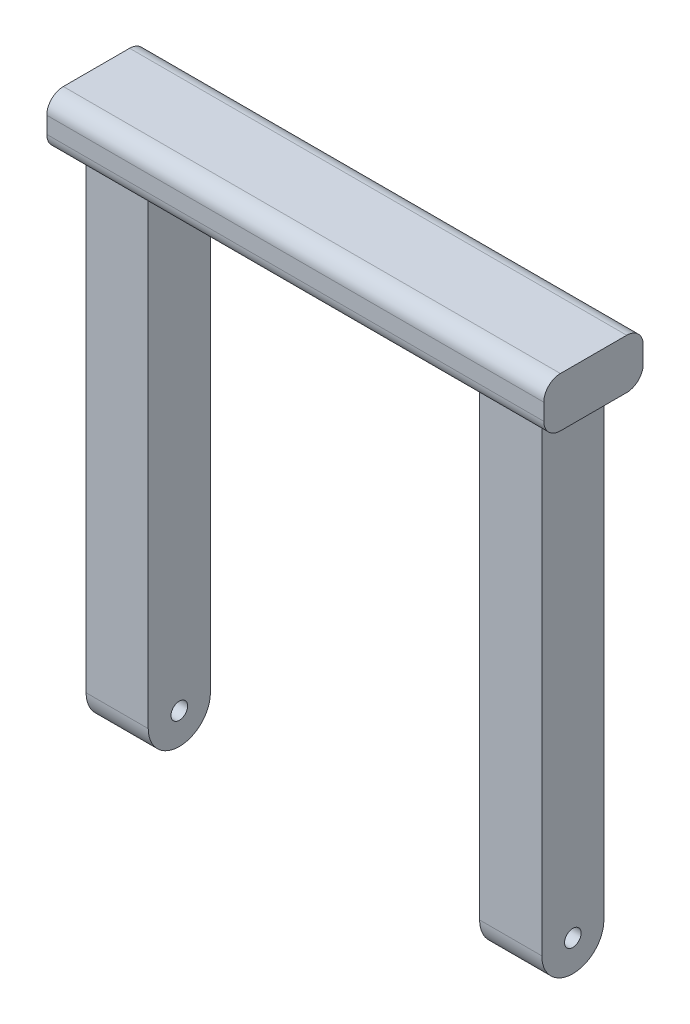
ISO-10303-21;
HEADER;
FILE_DESCRIPTION(('STEP AP214'),'2;1');
FILE_NAME('part.step','',(''),(''),'','','');
FILE_SCHEMA(('AUTOMOTIVE_DESIGN { 1 0 10303 214 1 1 1 1 }'));
ENDSEC;
DATA;
#1=APPLICATION_CONTEXT('core data for automotive mechanical design processes');
#2=APPLICATION_PROTOCOL_DEFINITION('international standard','automotive_design',2000,#1);
#3=PRODUCT_CONTEXT('',#1,'mechanical');
#4=PRODUCT('Part','Part','',(#3));
#5=PRODUCT_RELATED_PRODUCT_CATEGORY('part','',(#4));
#6=PRODUCT_DEFINITION_FORMATION('','',#4);
#7=PRODUCT_DEFINITION_CONTEXT('part definition',#1,'design');
#8=PRODUCT_DEFINITION('design','',#6,#7);
#9=PRODUCT_DEFINITION_SHAPE('','',#8);
#10=(LENGTH_UNIT() NAMED_UNIT(*) SI_UNIT(.MILLI.,.METRE.));
#11=(NAMED_UNIT(*) PLANE_ANGLE_UNIT() SI_UNIT($,.RADIAN.));
#12=(NAMED_UNIT(*) SI_UNIT($,.STERADIAN.) SOLID_ANGLE_UNIT());
#13=UNCERTAINTY_MEASURE_WITH_UNIT(LENGTH_MEASURE(1.E-05),#10,'distance_accuracy_value','');
#14=(GEOMETRIC_REPRESENTATION_CONTEXT(3) GLOBAL_UNCERTAINTY_ASSIGNED_CONTEXT((#13)) GLOBAL_UNIT_ASSIGNED_CONTEXT((#10,
#11,#12)) REPRESENTATION_CONTEXT('',''));
#15=CARTESIAN_POINT('',(0.,0.,0.));
#16=DIRECTION('',(0.,0.,1.));
#17=DIRECTION('',(1.,0.,0.));
#18=AXIS2_PLACEMENT_3D('',#15,#16,#17);
#19=CARTESIAN_POINT('',(0.,0.,0.));
#20=DIRECTION('',(0.,-1.,0.));
#21=DIRECTION('',(0.,0.,-1.));
#22=AXIS2_PLACEMENT_3D('',#19,#20,#21);
#23=PLANE('',#22);
#24=DIRECTION('',(0.,0.,1.));
#25=VECTOR('',#24,1.);
#26=CARTESIAN_POINT('',(0.,0.,0.));
#27=LINE('',#26,#25);
#28=CARTESIAN_POINT('',(0.,0.,-25.4));
#29=VERTEX_POINT('',#28);
#30=CARTESIAN_POINT('',(0.,0.,-5.08));
#31=VERTEX_POINT('',#30);
#32=EDGE_CURVE('E212',#29,#31,#27,.T.);
#33=ORIENTED_EDGE('',*,*,#32,.F.);
#34=DIRECTION('',(-1.,0.,0.));
#35=VECTOR('',#34,1.);
#36=CARTESIAN_POINT('',(152.4,0.,-25.4));
#37=LINE('',#36,#35);
#38=CARTESIAN_POINT('',(152.4,0.,-25.4));
#39=VERTEX_POINT('',#38);
#40=EDGE_CURVE('E293',#29,#39,#37,.F.);
#41=ORIENTED_EDGE('',*,*,#40,.T.);
#42=DIRECTION('',(0.,0.,-1.));
#43=VECTOR('',#42,1.);
#44=CARTESIAN_POINT('',(152.4,0.,0.));
#45=LINE('',#44,#43);
#46=CARTESIAN_POINT('',(152.4,0.,-5.08));
#47=VERTEX_POINT('',#46);
#48=EDGE_CURVE('E216',#47,#39,#45,.T.);
#49=ORIENTED_EDGE('',*,*,#48,.F.);
#50=DIRECTION('',(1.,0.,0.));
#51=VECTOR('',#50,1.);
#52=CARTESIAN_POINT('',(0.,0.,-5.08));
#53=LINE('',#52,#51);
#54=EDGE_CURVE('E283',#47,#31,#53,.F.);
#55=ORIENTED_EDGE('',*,*,#54,.T.);
#56=EDGE_LOOP('',(#33,#41,#49,#55));
#57=FACE_BOUND('',#56,.T.);
#58=DIRECTION('',(1.,0.,0.));
#59=VECTOR('',#58,1.);
#60=CARTESIAN_POINT('',(6.35000000000003,0.,-24.765));
#61=LINE('',#60,#59);
#62=CARTESIAN_POINT('',(6.35000000000003,0.,-24.765));
#63=VERTEX_POINT('',#62);
#64=CARTESIAN_POINT('',(25.4,0.,-24.765));
#65=VERTEX_POINT('',#64);
#66=EDGE_CURVE('E195',#63,#65,#61,.T.);
#67=ORIENTED_EDGE('',*,*,#66,.F.);
#68=DIRECTION('',(0.,0.,-1.));
#69=VECTOR('',#68,1.);
#70=CARTESIAN_POINT('',(6.35000000000003,0.,-5.71500000000002));
#71=LINE('',#70,#69);
#72=CARTESIAN_POINT('',(6.35000000000003,0.,-5.71500000000002));
#73=VERTEX_POINT('',#72);
#74=EDGE_CURVE('E168',#73,#63,#71,.T.);
#75=ORIENTED_EDGE('',*,*,#74,.F.);
#76=DIRECTION('',(-1.,0.,0.));
#77=VECTOR('',#76,1.);
#78=CARTESIAN_POINT('',(6.35000000000003,0.,-5.71500000000002));
#79=LINE('',#78,#77);
#80=CARTESIAN_POINT('',(25.4,0.,-5.71500000000002));
#81=VERTEX_POINT('',#80);
#82=EDGE_CURVE('E201',#81,#73,#79,.T.);
#83=ORIENTED_EDGE('',*,*,#82,.F.);
#84=DIRECTION('',(0.,0.,1.));
#85=VECTOR('',#84,1.);
#86=CARTESIAN_POINT('',(25.4,0.,-5.71500000000002));
#87=LINE('',#86,#85);
#88=EDGE_CURVE('E198',#65,#81,#87,.T.);
#89=ORIENTED_EDGE('',*,*,#88,.F.);
#90=EDGE_LOOP('',(#67,#75,#83,#89));
#91=FACE_BOUND('',#90,.T.);
#92=DIRECTION('',(-1.,0.,0.));
#93=VECTOR('',#92,1.);
#94=CARTESIAN_POINT('',(146.05,0.,-5.71500000000001));
#95=LINE('',#94,#93);
#96=CARTESIAN_POINT('',(146.05,0.,-5.71500000000001));
#97=VERTEX_POINT('',#96);
#98=CARTESIAN_POINT('',(127.,0.,-5.71500000000001));
#99=VERTEX_POINT('',#98);
#100=EDGE_CURVE('E162',#97,#99,#95,.T.);
#101=ORIENTED_EDGE('',*,*,#100,.F.);
#102=DIRECTION('',(0.,0.,1.));
#103=VECTOR('',#102,1.);
#104=CARTESIAN_POINT('',(146.05,0.,-5.71500000000001));
#105=LINE('',#104,#103);
#106=CARTESIAN_POINT('',(146.05,0.,-24.765));
#107=VERTEX_POINT('',#106);
#108=EDGE_CURVE('E172',#107,#97,#105,.T.);
#109=ORIENTED_EDGE('',*,*,#108,.F.);
#110=DIRECTION('',(1.,0.,0.));
#111=VECTOR('',#110,1.);
#112=CARTESIAN_POINT('',(146.05,0.,-24.765));
#113=LINE('',#112,#111);
#114=CARTESIAN_POINT('',(127.,0.,-24.765));
#115=VERTEX_POINT('',#114);
#116=EDGE_CURVE('E184',#115,#107,#113,.T.);
#117=ORIENTED_EDGE('',*,*,#116,.F.);
#118=DIRECTION('',(0.,0.,-1.));
#119=VECTOR('',#118,1.);
#120=CARTESIAN_POINT('',(127.,0.,-5.71500000000001));
#121=LINE('',#120,#119);
#122=EDGE_CURVE('E182',#99,#115,#121,.T.);
#123=ORIENTED_EDGE('',*,*,#122,.F.);
#124=EDGE_LOOP('',(#101,#109,#117,#123));
#125=FACE_BOUND('',#124,.T.);
#126=ADVANCED_FACE('F34',(#57,#91,#125),#23,.T.);
#127=CARTESIAN_POINT('',(0.,15.24,0.));
#128=DIRECTION('',(1.,0.,0.));
#129=DIRECTION('',(0.,0.,-1.));
#130=AXIS2_PLACEMENT_3D('',#127,#128,#129);
#131=PLANE('',#130);
#132=DIRECTION('',(0.,0.,1.));
#133=VECTOR('',#132,1.);
#134=CARTESIAN_POINT('',(0.,15.24,0.));
#135=LINE('',#134,#133);
#136=CARTESIAN_POINT('',(0.,15.24,-25.4));
#137=VERTEX_POINT('',#136);
#138=CARTESIAN_POINT('',(0.,15.24,-5.08));
#139=VERTEX_POINT('',#138);
#140=EDGE_CURVE('E213',#137,#139,#135,.T.);
#141=ORIENTED_EDGE('',*,*,#140,.F.);
#142=CARTESIAN_POINT('',(0.,10.16,-25.4));
#143=DIRECTION('',(1.,0.,0.));
#144=DIRECTION('',(0.,0.,-1.));
#145=AXIS2_PLACEMENT_3D('',#142,#143,#144);
#146=CIRCLE('',#145,5.08);
#147=CARTESIAN_POINT('',(0.,10.16,-30.48));
#148=VERTEX_POINT('',#147);
#149=EDGE_CURVE('E56',#137,#148,#146,.F.);
#150=ORIENTED_EDGE('',*,*,#149,.T.);
#151=DIRECTION('',(0.,-1.,0.));
#152=VECTOR('',#151,1.);
#153=CARTESIAN_POINT('',(0.,15.24,-30.48));
#154=LINE('',#153,#152);
#155=CARTESIAN_POINT('',(0.,5.08,-30.48));
#156=VERTEX_POINT('',#155);
#157=EDGE_CURVE('E219',#148,#156,#154,.T.);
#158=ORIENTED_EDGE('',*,*,#157,.T.);
#159=CARTESIAN_POINT('',(0.,5.08,-25.4));
#160=DIRECTION('',(1.,0.,0.));
#161=DIRECTION('',(0.,0.,-1.));
#162=AXIS2_PLACEMENT_3D('',#159,#160,#161);
#163=CIRCLE('',#162,5.08);
#164=EDGE_CURVE('E291',#156,#29,#163,.F.);
#165=ORIENTED_EDGE('',*,*,#164,.T.);
#166=ORIENTED_EDGE('',*,*,#32,.T.);
#167=CARTESIAN_POINT('',(0.,5.08,-5.08));
#168=DIRECTION('',(1.,0.,0.));
#169=DIRECTION('',(0.,0.,-1.));
#170=AXIS2_PLACEMENT_3D('',#167,#168,#169);
#171=CIRCLE('',#170,5.08);
#172=CARTESIAN_POINT('',(0.,5.08,0.));
#173=VERTEX_POINT('',#172);
#174=EDGE_CURVE('E286',#31,#173,#171,.F.);
#175=ORIENTED_EDGE('',*,*,#174,.T.);
#176=DIRECTION('',(0.,-1.,0.));
#177=VECTOR('',#176,1.);
#178=CARTESIAN_POINT('',(0.,15.24,0.));
#179=LINE('',#178,#177);
#180=CARTESIAN_POINT('',(0.,10.16,0.));
#181=VERTEX_POINT('',#180);
#182=EDGE_CURVE('E229',#181,#173,#179,.T.);
#183=ORIENTED_EDGE('',*,*,#182,.F.);
#184=CARTESIAN_POINT('',(0.,10.16,-5.08));
#185=DIRECTION('',(1.,0.,0.));
#186=DIRECTION('',(0.,0.,-1.));
#187=AXIS2_PLACEMENT_3D('',#184,#185,#186);
#188=CIRCLE('',#187,5.08);
#189=EDGE_CURVE('E275',#181,#139,#188,.F.);
#190=ORIENTED_EDGE('',*,*,#189,.T.);
#191=EDGE_LOOP('',(#141,#150,#158,#165,#166,#175,#183,#190));
#192=FACE_BOUND('',#191,.T.);
#193=ADVANCED_FACE('F307',(#192),#131,.F.);
#194=CARTESIAN_POINT('',(0.,15.24,0.));
#195=DIRECTION('',(0.,0.,-1.));
#196=DIRECTION('',(-1.,0.,0.));
#197=AXIS2_PLACEMENT_3D('',#194,#195,#196);
#198=PLANE('',#197);
#199=ORIENTED_EDGE('',*,*,#182,.T.);
#200=DIRECTION('',(1.,0.,0.));
#201=VECTOR('',#200,1.);
#202=CARTESIAN_POINT('',(152.4,5.08,0.));
#203=LINE('',#202,#201);
#204=CARTESIAN_POINT('',(152.4,5.08,0.));
#205=VERTEX_POINT('',#204);
#206=EDGE_CURVE('E278',#173,#205,#203,.T.);
#207=ORIENTED_EDGE('',*,*,#206,.T.);
#208=DIRECTION('',(0.,-1.,0.));
#209=VECTOR('',#208,1.);
#210=CARTESIAN_POINT('',(152.4,15.24,0.));
#211=LINE('',#210,#209);
#212=CARTESIAN_POINT('',(152.4,10.16,0.));
#213=VERTEX_POINT('',#212);
#214=EDGE_CURVE('E226',#213,#205,#211,.T.);
#215=ORIENTED_EDGE('',*,*,#214,.F.);
#216=DIRECTION('',(1.,0.,0.));
#217=VECTOR('',#216,1.);
#218=CARTESIAN_POINT('',(0.,10.16,0.));
#219=LINE('',#218,#217);
#220=EDGE_CURVE('E273',#213,#181,#219,.F.);
#221=ORIENTED_EDGE('',*,*,#220,.T.);
#222=EDGE_LOOP('',(#199,#207,#215,#221));
#223=FACE_BOUND('',#222,.T.);
#224=ADVANCED_FACE('F330',(#223),#198,.F.);
#225=CARTESIAN_POINT('',(152.4,15.24,0.));
#226=DIRECTION('',(-1.,0.,0.));
#227=DIRECTION('',(0.,0.,1.));
#228=AXIS2_PLACEMENT_3D('',#225,#226,#227);
#229=PLANE('',#228);
#230=DIRECTION('',(0.,-1.,0.));
#231=VECTOR('',#230,1.);
#232=CARTESIAN_POINT('',(152.4,15.24,-30.48));
#233=LINE('',#232,#231);
#234=CARTESIAN_POINT('',(152.4,10.16,-30.48));
#235=VERTEX_POINT('',#234);
#236=CARTESIAN_POINT('',(152.4,5.08,-30.48));
#237=VERTEX_POINT('',#236);
#238=EDGE_CURVE('E224',#235,#237,#233,.T.);
#239=ORIENTED_EDGE('',*,*,#238,.F.);
#240=CARTESIAN_POINT('',(152.4,10.16,-25.4));
#241=DIRECTION('',(-1.,0.,0.));
#242=DIRECTION('',(0.,0.,1.));
#243=AXIS2_PLACEMENT_3D('',#240,#241,#242);
#244=CIRCLE('',#243,5.08);
#245=CARTESIAN_POINT('',(152.4,15.24,-25.4));
#246=VERTEX_POINT('',#245);
#247=EDGE_CURVE('E11',#235,#246,#244,.F.);
#248=ORIENTED_EDGE('',*,*,#247,.T.);
#249=DIRECTION('',(0.,0.,-1.));
#250=VECTOR('',#249,1.);
#251=CARTESIAN_POINT('',(152.4,15.24,0.));
#252=LINE('',#251,#250);
#253=CARTESIAN_POINT('',(152.4,15.24,-5.08));
#254=VERTEX_POINT('',#253);
#255=EDGE_CURVE('E215',#254,#246,#252,.T.);
#256=ORIENTED_EDGE('',*,*,#255,.F.);
#257=CARTESIAN_POINT('',(152.4,10.16,-5.08));
#258=DIRECTION('',(-1.,0.,0.));
#259=DIRECTION('',(0.,0.,1.));
#260=AXIS2_PLACEMENT_3D('',#257,#258,#259);
#261=CIRCLE('',#260,5.08);
#262=EDGE_CURVE('E271',#254,#213,#261,.F.);
#263=ORIENTED_EDGE('',*,*,#262,.T.);
#264=ORIENTED_EDGE('',*,*,#214,.T.);
#265=CARTESIAN_POINT('',(152.4,5.08,-5.08));
#266=DIRECTION('',(-1.,0.,0.));
#267=DIRECTION('',(0.,0.,1.));
#268=AXIS2_PLACEMENT_3D('',#265,#266,#267);
#269=CIRCLE('',#268,5.08);
#270=EDGE_CURVE('E281',#205,#47,#269,.F.);
#271=ORIENTED_EDGE('',*,*,#270,.T.);
#272=ORIENTED_EDGE('',*,*,#48,.T.);
#273=CARTESIAN_POINT('',(152.4,5.08,-25.4));
#274=DIRECTION('',(-1.,0.,0.));
#275=DIRECTION('',(0.,0.,1.));
#276=AXIS2_PLACEMENT_3D('',#273,#274,#275);
#277=CIRCLE('',#276,5.08);
#278=EDGE_CURVE('E295',#39,#237,#277,.F.);
#279=ORIENTED_EDGE('',*,*,#278,.T.);
#280=EDGE_LOOP('',(#239,#248,#256,#263,#264,#271,#272,#279));
#281=FACE_BOUND('',#280,.T.);
#282=ADVANCED_FACE('F315',(#281),#229,.F.);
#283=CARTESIAN_POINT('',(0.,15.24,-30.48));
#284=DIRECTION('',(0.,0.,1.));
#285=DIRECTION('',(1.,0.,0.));
#286=AXIS2_PLACEMENT_3D('',#283,#284,#285);
#287=PLANE('',#286);
#288=ORIENTED_EDGE('',*,*,#157,.F.);
#289=DIRECTION('',(-1.,0.,0.));
#290=VECTOR('',#289,1.);
#291=CARTESIAN_POINT('',(0.,10.16,-30.48));
#292=LINE('',#291,#290);
#293=EDGE_CURVE('E42',#148,#235,#292,.F.);
#294=ORIENTED_EDGE('',*,*,#293,.T.);
#295=ORIENTED_EDGE('',*,*,#238,.T.);
#296=DIRECTION('',(-1.,0.,0.));
#297=VECTOR('',#296,1.);
#298=CARTESIAN_POINT('',(0.,5.08,-30.48));
#299=LINE('',#298,#297);
#300=EDGE_CURVE('E288',#237,#156,#299,.T.);
#301=ORIENTED_EDGE('',*,*,#300,.T.);
#302=EDGE_LOOP('',(#288,#294,#295,#301));
#303=FACE_BOUND('',#302,.T.);
#304=ADVANCED_FACE('F337',(#303),#287,.F.);
#305=CARTESIAN_POINT('',(0.,15.24,0.));
#306=DIRECTION('',(0.,-1.,0.));
#307=DIRECTION('',(0.,0.,-1.));
#308=AXIS2_PLACEMENT_3D('',#305,#306,#307);
#309=PLANE('',#308);
#310=ORIENTED_EDGE('',*,*,#255,.T.);
#311=DIRECTION('',(-1.,0.,0.));
#312=VECTOR('',#311,1.);
#313=CARTESIAN_POINT('',(0.,15.24,-25.4));
#314=LINE('',#313,#312);
#315=EDGE_CURVE('E298',#246,#137,#314,.T.);
#316=ORIENTED_EDGE('',*,*,#315,.T.);
#317=ORIENTED_EDGE('',*,*,#140,.T.);
#318=DIRECTION('',(1.,0.,0.));
#319=VECTOR('',#318,1.);
#320=CARTESIAN_POINT('',(0.,15.24,-5.08));
#321=LINE('',#320,#319);
#322=EDGE_CURVE('E268',#139,#254,#321,.T.);
#323=ORIENTED_EDGE('',*,*,#322,.T.);
#324=EDGE_LOOP('',(#310,#316,#317,#323));
#325=FACE_BOUND('',#324,.T.);
#326=ADVANCED_FACE('F303',(#325),#309,.F.);
#327=CARTESIAN_POINT('',(6.35000000000003,-152.4,-5.71500000000002));
#328=DIRECTION('',(1.,0.,0.));
#329=DIRECTION('',(0.,0.,-1.));
#330=AXIS2_PLACEMENT_3D('',#327,#328,#329);
#331=PLANE('',#330);
#332=CARTESIAN_POINT('',(6.35000000000003,-142.875,-15.24));
#333=DIRECTION('',(-1.,0.,0.));
#334=DIRECTION('',(0.,0.,1.));
#335=AXIS2_PLACEMENT_3D('',#332,#333,#334);
#336=CIRCLE('',#335,2.54000000000001);
#337=CARTESIAN_POINT('',(6.35000000000003,-142.875,-12.7));
#338=VERTEX_POINT('',#337);
#339=EDGE_CURVE('E237',#338,#338,#336,.T.);
#340=ORIENTED_EDGE('',*,*,#339,.F.);
#341=EDGE_LOOP('',(#340));
#342=FACE_BOUND('',#341,.T.);
#343=DIRECTION('',(0.,1.,0.));
#344=VECTOR('',#343,1.);
#345=CARTESIAN_POINT('',(6.35000000000003,-152.4,-24.765));
#346=LINE('',#345,#344);
#347=CARTESIAN_POINT('',(6.35000000000003,-142.875,-24.765));
#348=VERTEX_POINT('',#347);
#349=EDGE_CURVE('E210',#348,#63,#346,.T.);
#350=ORIENTED_EDGE('',*,*,#349,.F.);
#351=CARTESIAN_POINT('',(6.35000000000003,-142.875,-15.24));
#352=DIRECTION('',(1.,0.,0.));
#353=DIRECTION('',(0.,0.,-1.));
#354=AXIS2_PLACEMENT_3D('',#351,#352,#353);
#355=CIRCLE('',#354,9.525);
#356=CARTESIAN_POINT('',(6.35000000000003,-152.4,-15.24));
#357=VERTEX_POINT('',#356);
#358=EDGE_CURVE('E251',#348,#357,#355,.F.);
#359=ORIENTED_EDGE('',*,*,#358,.T.);
#360=CARTESIAN_POINT('',(6.35000000000003,-142.875,-15.24));
#361=DIRECTION('',(1.,0.,0.));
#362=DIRECTION('',(0.,0.,-1.));
#363=AXIS2_PLACEMENT_3D('',#360,#361,#362);
#364=CIRCLE('',#363,9.525);
#365=CARTESIAN_POINT('',(6.35000000000003,-142.875,-5.71500000000002));
#366=VERTEX_POINT('',#365);
#367=EDGE_CURVE('E240',#357,#366,#364,.F.);
#368=ORIENTED_EDGE('',*,*,#367,.T.);
#369=DIRECTION('',(0.,1.,0.));
#370=VECTOR('',#369,1.);
#371=CARTESIAN_POINT('',(6.35000000000003,-152.4,-5.71500000000002));
#372=LINE('',#371,#370);
#373=EDGE_CURVE('E204',#366,#73,#372,.T.);
#374=ORIENTED_EDGE('',*,*,#373,.T.);
#375=ORIENTED_EDGE('',*,*,#74,.T.);
#376=EDGE_LOOP('',(#350,#359,#368,#374,#375));
#377=FACE_BOUND('',#376,.T.);
#378=ADVANCED_FACE('F413',(#342,#377),#331,.F.);
#379=CARTESIAN_POINT('',(6.35000000000003,-152.4,-24.765));
#380=DIRECTION('',(0.,0.,1.));
#381=DIRECTION('',(1.,0.,0.));
#382=AXIS2_PLACEMENT_3D('',#379,#380,#381);
#383=PLANE('',#382);
#384=DIRECTION('',(0.,1.,0.));
#385=VECTOR('',#384,1.);
#386=CARTESIAN_POINT('',(25.4,-152.4,-24.765));
#387=LINE('',#386,#385);
#388=CARTESIAN_POINT('',(25.4,-142.875,-24.765));
#389=VERTEX_POINT('',#388);
#390=EDGE_CURVE('E208',#389,#65,#387,.T.);
#391=ORIENTED_EDGE('',*,*,#390,.F.);
#392=DIRECTION('',(1.,0.,0.));
#393=VECTOR('',#392,1.);
#394=CARTESIAN_POINT('',(6.35000000000003,-142.875,-24.765));
#395=LINE('',#394,#393);
#396=EDGE_CURVE('E249',#389,#348,#395,.F.);
#397=ORIENTED_EDGE('',*,*,#396,.T.);
#398=ORIENTED_EDGE('',*,*,#349,.T.);
#399=ORIENTED_EDGE('',*,*,#66,.T.);
#400=EDGE_LOOP('',(#391,#397,#398,#399));
#401=FACE_BOUND('',#400,.T.);
#402=ADVANCED_FACE('F424',(#401),#383,.F.);
#403=CARTESIAN_POINT('',(25.4,-152.4,-5.71500000000002));
#404=DIRECTION('',(-1.,0.,0.));
#405=DIRECTION('',(0.,0.,1.));
#406=AXIS2_PLACEMENT_3D('',#403,#404,#405);
#407=PLANE('',#406);
#408=CARTESIAN_POINT('',(25.4,-142.875,-15.24));
#409=DIRECTION('',(-1.,0.,0.));
#410=DIRECTION('',(0.,0.,1.));
#411=AXIS2_PLACEMENT_3D('',#408,#409,#410);
#412=CIRCLE('',#411,2.54000000000001);
#413=CARTESIAN_POINT('',(25.4,-142.875,-12.7));
#414=VERTEX_POINT('',#413);
#415=EDGE_CURVE('E179',#414,#414,#412,.T.);
#416=ORIENTED_EDGE('',*,*,#415,.T.);
#417=EDGE_LOOP('',(#416));
#418=FACE_BOUND('',#417,.T.);
#419=CARTESIAN_POINT('',(25.4,-142.875,-15.24));
#420=DIRECTION('',(-1.,0.,0.));
#421=DIRECTION('',(0.,0.,1.));
#422=AXIS2_PLACEMENT_3D('',#419,#420,#421);
#423=CIRCLE('',#422,9.525);
#424=CARTESIAN_POINT('',(25.4,-142.875,-5.71500000000002));
#425=VERTEX_POINT('',#424);
#426=CARTESIAN_POINT('',(25.4,-152.4,-15.24));
#427=VERTEX_POINT('',#426);
#428=EDGE_CURVE('E244',#425,#427,#423,.F.);
#429=ORIENTED_EDGE('',*,*,#428,.T.);
#430=CARTESIAN_POINT('',(25.4,-142.875,-15.24));
#431=DIRECTION('',(-1.,0.,0.));
#432=DIRECTION('',(0.,0.,1.));
#433=AXIS2_PLACEMENT_3D('',#430,#431,#432);
#434=CIRCLE('',#433,9.525);
#435=EDGE_CURVE('E247',#427,#389,#434,.F.);
#436=ORIENTED_EDGE('',*,*,#435,.T.);
#437=ORIENTED_EDGE('',*,*,#390,.T.);
#438=ORIENTED_EDGE('',*,*,#88,.T.);
#439=DIRECTION('',(0.,1.,0.));
#440=VECTOR('',#439,1.);
#441=CARTESIAN_POINT('',(25.4,-152.4,-5.71500000000002));
#442=LINE('',#441,#440);
#443=EDGE_CURVE('E206',#425,#81,#442,.T.);
#444=ORIENTED_EDGE('',*,*,#443,.F.);
#445=EDGE_LOOP('',(#429,#436,#437,#438,#444));
#446=FACE_BOUND('',#445,.T.);
#447=ADVANCED_FACE('F432',(#418,#446),#407,.F.);
#448=CARTESIAN_POINT('',(6.35000000000003,-152.4,-5.71500000000002));
#449=DIRECTION('',(0.,0.,-1.));
#450=DIRECTION('',(-1.,0.,0.));
#451=AXIS2_PLACEMENT_3D('',#448,#449,#450);
#452=PLANE('',#451);
#453=ORIENTED_EDGE('',*,*,#373,.F.);
#454=DIRECTION('',(-1.,0.,0.));
#455=VECTOR('',#454,1.);
#456=CARTESIAN_POINT('',(25.4,-142.875,-5.71500000000002));
#457=LINE('',#456,#455);
#458=EDGE_CURVE('E242',#366,#425,#457,.F.);
#459=ORIENTED_EDGE('',*,*,#458,.T.);
#460=ORIENTED_EDGE('',*,*,#443,.T.);
#461=ORIENTED_EDGE('',*,*,#82,.T.);
#462=EDGE_LOOP('',(#453,#459,#460,#461));
#463=FACE_BOUND('',#462,.T.);
#464=ADVANCED_FACE('F440',(#463),#452,.F.);
#465=CARTESIAN_POINT('',(146.05,-152.4,-5.71500000000001));
#466=DIRECTION('',(-1.,0.,0.));
#467=DIRECTION('',(0.,0.,1.));
#468=AXIS2_PLACEMENT_3D('',#465,#466,#467);
#469=PLANE('',#468);
#470=CARTESIAN_POINT('',(146.05,-142.875,-15.24));
#471=DIRECTION('',(-1.,0.,0.));
#472=DIRECTION('',(0.,0.,1.));
#473=AXIS2_PLACEMENT_3D('',#470,#471,#472);
#474=CIRCLE('',#473,2.54000000000001);
#475=CARTESIAN_POINT('',(146.05,-142.875,-12.7));
#476=VERTEX_POINT('',#475);
#477=EDGE_CURVE('E236',#476,#476,#474,.T.);
#478=ORIENTED_EDGE('',*,*,#477,.T.);
#479=EDGE_LOOP('',(#478));
#480=FACE_BOUND('',#479,.T.);
#481=DIRECTION('',(0.,1.,0.));
#482=VECTOR('',#481,1.);
#483=CARTESIAN_POINT('',(146.05,-152.4,-5.71500000000001));
#484=LINE('',#483,#482);
#485=CARTESIAN_POINT('',(146.05,-142.875,-5.71500000000001));
#486=VERTEX_POINT('',#485);
#487=EDGE_CURVE('E157',#486,#97,#484,.T.);
#488=ORIENTED_EDGE('',*,*,#487,.F.);
#489=CARTESIAN_POINT('',(146.05,-142.875,-15.24));
#490=DIRECTION('',(-1.,0.,0.));
#491=DIRECTION('',(0.,0.,1.));
#492=AXIS2_PLACEMENT_3D('',#489,#490,#491);
#493=CIRCLE('',#492,9.525);
#494=CARTESIAN_POINT('',(146.05,-152.4,-15.24));
#495=VERTEX_POINT('',#494);
#496=EDGE_CURVE('E266',#486,#495,#493,.F.);
#497=ORIENTED_EDGE('',*,*,#496,.T.);
#498=CARTESIAN_POINT('',(146.05,-142.875,-15.24));
#499=DIRECTION('',(-1.,0.,0.));
#500=DIRECTION('',(0.,0.,1.));
#501=AXIS2_PLACEMENT_3D('',#498,#499,#500);
#502=CIRCLE('',#501,9.525);
#503=CARTESIAN_POINT('',(146.05,-142.875,-24.765));
#504=VERTEX_POINT('',#503);
#505=EDGE_CURVE('E256',#495,#504,#502,.F.);
#506=ORIENTED_EDGE('',*,*,#505,.T.);
#507=DIRECTION('',(0.,1.,0.));
#508=VECTOR('',#507,1.);
#509=CARTESIAN_POINT('',(146.05,-152.4,-24.765));
#510=LINE('',#509,#508);
#511=EDGE_CURVE('E175',#504,#107,#510,.T.);
#512=ORIENTED_EDGE('',*,*,#511,.T.);
#513=ORIENTED_EDGE('',*,*,#108,.T.);
#514=EDGE_LOOP('',(#488,#497,#506,#512,#513));
#515=FACE_BOUND('',#514,.T.);
#516=ADVANCED_FACE('F173',(#480,#515),#469,.F.);
#517=CARTESIAN_POINT('',(146.05,-152.4,-5.71500000000001));
#518=DIRECTION('',(0.,0.,-1.));
#519=DIRECTION('',(-1.,0.,0.));
#520=AXIS2_PLACEMENT_3D('',#517,#518,#519);
#521=PLANE('',#520);
#522=DIRECTION('',(0.,1.,0.));
#523=VECTOR('',#522,1.);
#524=CARTESIAN_POINT('',(127.,-152.4,-5.71500000000001));
#525=LINE('',#524,#523);
#526=CARTESIAN_POINT('',(127.,-142.875,-5.71500000000001));
#527=VERTEX_POINT('',#526);
#528=EDGE_CURVE('E169',#527,#99,#525,.T.);
#529=ORIENTED_EDGE('',*,*,#528,.F.);
#530=DIRECTION('',(-1.,0.,0.));
#531=VECTOR('',#530,1.);
#532=CARTESIAN_POINT('',(146.05,-142.875,-5.71500000000001));
#533=LINE('',#532,#531);
#534=EDGE_CURVE('E165',#527,#486,#533,.F.);
#535=ORIENTED_EDGE('',*,*,#534,.T.);
#536=ORIENTED_EDGE('',*,*,#487,.T.);
#537=ORIENTED_EDGE('',*,*,#100,.T.);
#538=EDGE_LOOP('',(#529,#535,#536,#537));
#539=FACE_BOUND('',#538,.T.);
#540=ADVANCED_FACE('F160',(#539),#521,.F.);
#541=CARTESIAN_POINT('',(127.,-152.4,-5.71500000000001));
#542=DIRECTION('',(1.,0.,0.));
#543=DIRECTION('',(0.,0.,-1.));
#544=AXIS2_PLACEMENT_3D('',#541,#542,#543);
#545=PLANE('',#544);
#546=CARTESIAN_POINT('',(127.,-142.875,-15.24));
#547=DIRECTION('',(1.,0.,0.));
#548=DIRECTION('',(0.,0.,-1.));
#549=AXIS2_PLACEMENT_3D('',#546,#547,#548);
#550=CIRCLE('',#549,2.54000000000001);
#551=CARTESIAN_POINT('',(127.,-142.875,-17.78));
#552=VERTEX_POINT('',#551);
#553=EDGE_CURVE('E233',#552,#552,#550,.T.);
#554=ORIENTED_EDGE('',*,*,#553,.T.);
#555=EDGE_LOOP('',(#554));
#556=FACE_BOUND('',#555,.T.);
#557=CARTESIAN_POINT('',(127.,-142.875,-15.24));
#558=DIRECTION('',(1.,0.,0.));
#559=DIRECTION('',(0.,0.,-1.));
#560=AXIS2_PLACEMENT_3D('',#557,#558,#559);
#561=CIRCLE('',#560,9.525);
#562=CARTESIAN_POINT('',(127.,-142.875,-24.765));
#563=VERTEX_POINT('',#562);
#564=CARTESIAN_POINT('',(127.,-152.4,-15.24));
#565=VERTEX_POINT('',#564);
#566=EDGE_CURVE('E260',#563,#565,#561,.F.);
#567=ORIENTED_EDGE('',*,*,#566,.T.);
#568=CARTESIAN_POINT('',(127.,-142.875,-15.24));
#569=DIRECTION('',(1.,0.,0.));
#570=DIRECTION('',(0.,0.,-1.));
#571=AXIS2_PLACEMENT_3D('',#568,#569,#570);
#572=CIRCLE('',#571,9.525);
#573=EDGE_CURVE('E263',#565,#527,#572,.F.);
#574=ORIENTED_EDGE('',*,*,#573,.T.);
#575=ORIENTED_EDGE('',*,*,#528,.T.);
#576=ORIENTED_EDGE('',*,*,#122,.T.);
#577=DIRECTION('',(0.,1.,0.));
#578=VECTOR('',#577,1.);
#579=CARTESIAN_POINT('',(127.,-152.4,-24.765));
#580=LINE('',#579,#578);
#581=EDGE_CURVE('E190',#563,#115,#580,.T.);
#582=ORIENTED_EDGE('',*,*,#581,.F.);
#583=EDGE_LOOP('',(#567,#574,#575,#576,#582));
#584=FACE_BOUND('',#583,.T.);
#585=ADVANCED_FACE('F464',(#556,#584),#545,.F.);
#586=CARTESIAN_POINT('',(146.05,-152.4,-24.765));
#587=DIRECTION('',(0.,0.,1.));
#588=DIRECTION('',(1.,0.,0.));
#589=AXIS2_PLACEMENT_3D('',#586,#587,#588);
#590=PLANE('',#589);
#591=ORIENTED_EDGE('',*,*,#511,.F.);
#592=DIRECTION('',(1.,0.,0.));
#593=VECTOR('',#592,1.);
#594=CARTESIAN_POINT('',(146.05,-142.875,-24.765));
#595=LINE('',#594,#593);
#596=EDGE_CURVE('E258',#504,#563,#595,.F.);
#597=ORIENTED_EDGE('',*,*,#596,.T.);
#598=ORIENTED_EDGE('',*,*,#581,.T.);
#599=ORIENTED_EDGE('',*,*,#116,.T.);
#600=EDGE_LOOP('',(#591,#597,#598,#599));
#601=FACE_BOUND('',#600,.T.);
#602=ADVANCED_FACE('F471',(#601),#590,.F.);
#603=CARTESIAN_POINT('',(152.4,-142.875,-15.24));
#604=DIRECTION('',(-1.,0.,0.));
#605=DIRECTION('',(0.,0.,1.));
#606=AXIS2_PLACEMENT_3D('',#603,#604,#605);
#607=CYLINDRICAL_SURFACE('',#606,2.54000000000001);
#608=ORIENTED_EDGE('',*,*,#553,.F.);
#609=EDGE_LOOP('',(#608));
#610=FACE_BOUND('',#609,.T.);
#611=ORIENTED_EDGE('',*,*,#477,.F.);
#612=EDGE_LOOP('',(#611));
#613=FACE_BOUND('',#612,.T.);
#614=ADVANCED_FACE('F479',(#610,#613),#607,.F.);
#615=ORIENTED_EDGE('',*,*,#339,.T.);
#616=EDGE_LOOP('',(#615));
#617=FACE_BOUND('',#616,.T.);
#618=ORIENTED_EDGE('',*,*,#415,.F.);
#619=EDGE_LOOP('',(#618));
#620=FACE_BOUND('',#619,.T.);
#621=ADVANCED_FACE('F349',(#617,#620),#607,.F.);
#622=CARTESIAN_POINT('',(0.,-142.875,-15.24));
#623=DIRECTION('',(1.,0.,0.));
#624=DIRECTION('',(0.,0.,-1.));
#625=AXIS2_PLACEMENT_3D('',#622,#623,#624);
#626=CYLINDRICAL_SURFACE('',#625,9.525);
#627=ORIENTED_EDGE('',*,*,#428,.F.);
#628=ORIENTED_EDGE('',*,*,#458,.F.);
#629=ORIENTED_EDGE('',*,*,#367,.F.);
#630=DIRECTION('',(-1.,0.,0.));
#631=VECTOR('',#630,1.);
#632=CARTESIAN_POINT('',(6.35000000000003,-152.4,-15.24));
#633=LINE('',#632,#631);
#634=EDGE_CURVE('E232',#427,#357,#633,.T.);
#635=ORIENTED_EDGE('',*,*,#634,.F.);
#636=EDGE_LOOP('',(#627,#628,#629,#635));
#637=FACE_BOUND('',#636,.T.);
#638=ADVANCED_FACE('F345',(#637),#626,.T.);
#639=CARTESIAN_POINT('',(0.,-142.875,-15.24));
#640=DIRECTION('',(-1.,0.,0.));
#641=DIRECTION('',(0.,0.,1.));
#642=AXIS2_PLACEMENT_3D('',#639,#640,#641);
#643=CYLINDRICAL_SURFACE('',#642,9.525);
#644=ORIENTED_EDGE('',*,*,#358,.F.);
#645=ORIENTED_EDGE('',*,*,#396,.F.);
#646=ORIENTED_EDGE('',*,*,#435,.F.);
#647=ORIENTED_EDGE('',*,*,#634,.T.);
#648=EDGE_LOOP('',(#644,#645,#646,#647));
#649=FACE_BOUND('',#648,.T.);
#650=ADVANCED_FACE('F348',(#649),#643,.T.);
#651=CARTESIAN_POINT('',(0.,-142.875,-15.24));
#652=DIRECTION('',(1.,0.,0.));
#653=DIRECTION('',(0.,0.,-1.));
#654=AXIS2_PLACEMENT_3D('',#651,#652,#653);
#655=CYLINDRICAL_SURFACE('',#654,9.525);
#656=ORIENTED_EDGE('',*,*,#566,.F.);
#657=ORIENTED_EDGE('',*,*,#596,.F.);
#658=ORIENTED_EDGE('',*,*,#505,.F.);
#659=DIRECTION('',(1.,0.,0.));
#660=VECTOR('',#659,1.);
#661=CARTESIAN_POINT('',(0.,-152.4,-15.24));
#662=LINE('',#661,#660);
#663=EDGE_CURVE('E253',#565,#495,#662,.T.);
#664=ORIENTED_EDGE('',*,*,#663,.F.);
#665=EDGE_LOOP('',(#656,#657,#658,#664));
#666=FACE_BOUND('',#665,.T.);
#667=ADVANCED_FACE('F353',(#666),#655,.T.);
#668=CARTESIAN_POINT('',(0.,-142.875,-15.24));
#669=DIRECTION('',(-1.,0.,0.));
#670=DIRECTION('',(0.,0.,1.));
#671=AXIS2_PLACEMENT_3D('',#668,#669,#670);
#672=CYLINDRICAL_SURFACE('',#671,9.525);
#673=ORIENTED_EDGE('',*,*,#496,.F.);
#674=ORIENTED_EDGE('',*,*,#534,.F.);
#675=ORIENTED_EDGE('',*,*,#573,.F.);
#676=ORIENTED_EDGE('',*,*,#663,.T.);
#677=EDGE_LOOP('',(#673,#674,#675,#676));
#678=FACE_BOUND('',#677,.T.);
#679=ADVANCED_FACE('F357',(#678),#672,.T.);
#680=CARTESIAN_POINT('',(0.,10.16,-5.08));
#681=DIRECTION('',(1.,0.,0.));
#682=DIRECTION('',(0.,0.,-1.));
#683=AXIS2_PLACEMENT_3D('',#680,#681,#682);
#684=CYLINDRICAL_SURFACE('',#683,5.08);
#685=ORIENTED_EDGE('',*,*,#189,.F.);
#686=ORIENTED_EDGE('',*,*,#220,.F.);
#687=ORIENTED_EDGE('',*,*,#262,.F.);
#688=ORIENTED_EDGE('',*,*,#322,.F.);
#689=EDGE_LOOP('',(#685,#686,#687,#688));
#690=FACE_BOUND('',#689,.T.);
#691=ADVANCED_FACE('F313',(#690),#684,.T.);
#692=CARTESIAN_POINT('',(0.,5.08,-5.08));
#693=DIRECTION('',(-1.,0.,0.));
#694=DIRECTION('',(0.,0.,1.));
#695=AXIS2_PLACEMENT_3D('',#692,#693,#694);
#696=CYLINDRICAL_SURFACE('',#695,5.08);
#697=ORIENTED_EDGE('',*,*,#174,.F.);
#698=ORIENTED_EDGE('',*,*,#54,.F.);
#699=ORIENTED_EDGE('',*,*,#270,.F.);
#700=ORIENTED_EDGE('',*,*,#206,.F.);
#701=EDGE_LOOP('',(#697,#698,#699,#700));
#702=FACE_BOUND('',#701,.T.);
#703=ADVANCED_FACE('F322',(#702),#696,.T.);
#704=CARTESIAN_POINT('',(0.,5.08,-25.4));
#705=DIRECTION('',(1.,0.,0.));
#706=DIRECTION('',(0.,0.,-1.));
#707=AXIS2_PLACEMENT_3D('',#704,#705,#706);
#708=CYLINDRICAL_SURFACE('',#707,5.08);
#709=ORIENTED_EDGE('',*,*,#278,.F.);
#710=ORIENTED_EDGE('',*,*,#40,.F.);
#711=ORIENTED_EDGE('',*,*,#164,.F.);
#712=ORIENTED_EDGE('',*,*,#300,.F.);
#713=EDGE_LOOP('',(#709,#710,#711,#712));
#714=FACE_BOUND('',#713,.T.);
#715=ADVANCED_FACE('F318',(#714),#708,.T.);
#716=CARTESIAN_POINT('',(0.,10.16,-25.4));
#717=DIRECTION('',(-1.,0.,0.));
#718=DIRECTION('',(0.,0.,1.));
#719=AXIS2_PLACEMENT_3D('',#716,#717,#718);
#720=CYLINDRICAL_SURFACE('',#719,5.08);
#721=ORIENTED_EDGE('',*,*,#247,.F.);
#722=ORIENTED_EDGE('',*,*,#293,.F.);
#723=ORIENTED_EDGE('',*,*,#149,.F.);
#724=ORIENTED_EDGE('',*,*,#315,.F.);
#725=EDGE_LOOP('',(#721,#722,#723,#724));
#726=FACE_BOUND('',#725,.T.);
#727=ADVANCED_FACE('F36',(#726),#720,.T.);
#728=CLOSED_SHELL('',(#126,#193,#224,#282,#304,#326,#378,#402,#447,#464,#516,#540,#585,#602,
#614,#621,#638,#650,#667,#679,#691,#703,#715,#727));
#729=MANIFOLD_SOLID_BREP('B2',#728);
#730=ADVANCED_BREP_SHAPE_REPRESENTATION('',(#18,#729),#14);
#731=SHAPE_DEFINITION_REPRESENTATION(#9,#730);
ENDSEC;
END-ISO-10303-21;
